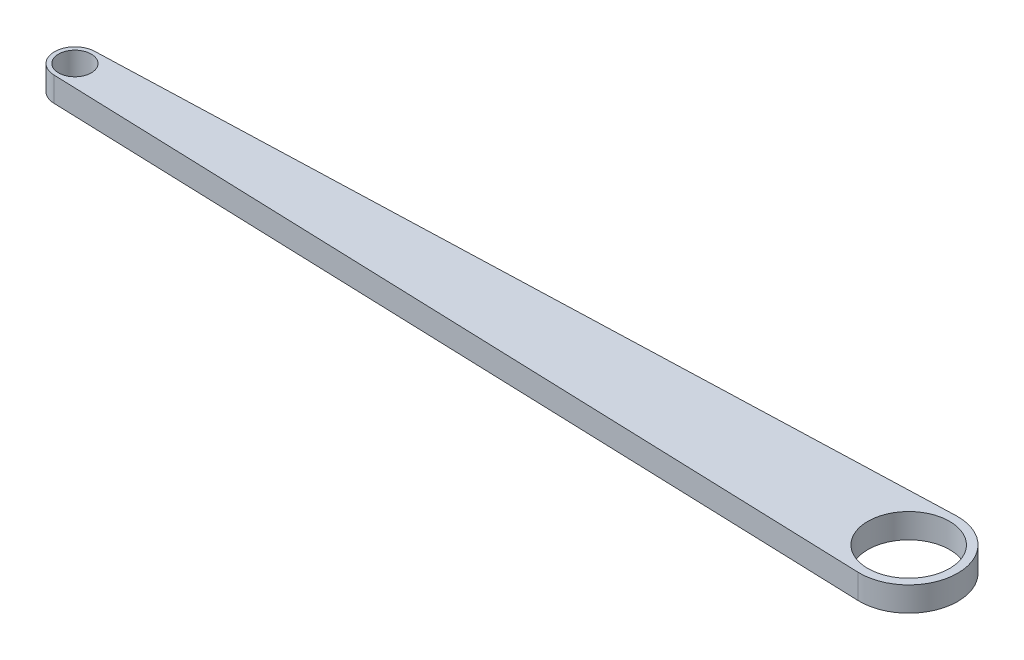
ISO-10303-21;
HEADER;
FILE_DESCRIPTION(('STEP AP214'),'2;1');
FILE_NAME('part.step','',(''),(''),'','','');
FILE_SCHEMA(('AUTOMOTIVE_DESIGN { 1 0 10303 214 1 1 1 1 }'));
ENDSEC;
DATA;
#1=APPLICATION_CONTEXT('core data for automotive mechanical design processes');
#2=APPLICATION_PROTOCOL_DEFINITION('international standard','automotive_design',2000,#1);
#3=PRODUCT_CONTEXT('',#1,'mechanical');
#4=PRODUCT('Part','Part','',(#3));
#5=PRODUCT_RELATED_PRODUCT_CATEGORY('part','',(#4));
#6=PRODUCT_DEFINITION_FORMATION('','',#4);
#7=PRODUCT_DEFINITION_CONTEXT('part definition',#1,'design');
#8=PRODUCT_DEFINITION('design','',#6,#7);
#9=PRODUCT_DEFINITION_SHAPE('','',#8);
#10=(LENGTH_UNIT() NAMED_UNIT(*) SI_UNIT(.MILLI.,.METRE.));
#11=(NAMED_UNIT(*) PLANE_ANGLE_UNIT() SI_UNIT($,.RADIAN.));
#12=(NAMED_UNIT(*) SI_UNIT($,.STERADIAN.) SOLID_ANGLE_UNIT());
#13=UNCERTAINTY_MEASURE_WITH_UNIT(LENGTH_MEASURE(1.E-05),#10,'distance_accuracy_value','');
#14=(GEOMETRIC_REPRESENTATION_CONTEXT(3) GLOBAL_UNCERTAINTY_ASSIGNED_CONTEXT((#13)) GLOBAL_UNIT_ASSIGNED_CONTEXT((#10,
#11,#12)) REPRESENTATION_CONTEXT('',''));
#15=CARTESIAN_POINT('',(0.,0.,0.));
#16=DIRECTION('',(0.,0.,1.));
#17=DIRECTION('',(1.,0.,0.));
#18=AXIS2_PLACEMENT_3D('',#15,#16,#17);
#19=CARTESIAN_POINT('',(-51.,0.75,0.));
#20=DIRECTION('',(0.,-1.,0.));
#21=DIRECTION('',(0.,0.,-1.));
#22=AXIS2_PLACEMENT_3D('',#19,#20,#21);
#23=CYLINDRICAL_SURFACE('',#22,1.25);
#24=CARTESIAN_POINT('',(-51.,-0.75,0.));
#25=DIRECTION('',(0.,1.,0.));
#26=DIRECTION('',(0.,0.,1.));
#27=AXIS2_PLACEMENT_3D('',#24,#25,#26);
#28=CIRCLE('',#27,1.25);
#29=CARTESIAN_POINT('',(-51.0428921568627,-0.75,-1.24926388840775));
#30=VERTEX_POINT('',#29);
#31=CARTESIAN_POINT('',(-51.0428921568627,-0.75,1.24926388840775));
#32=VERTEX_POINT('',#31);
#33=EDGE_CURVE('E95',#30,#32,#28,.T.);
#34=ORIENTED_EDGE('',*,*,#33,.T.);
#35=DIRECTION('',(0.,-1.,0.));
#36=VECTOR('',#35,1.);
#37=CARTESIAN_POINT('',(-51.0428921568627,0.75,1.24926388840775));
#38=LINE('',#37,#36);
#39=CARTESIAN_POINT('',(-51.0428921568627,0.75,1.24926388840775));
#40=VERTEX_POINT('',#39);
#41=EDGE_CURVE('E11',#40,#32,#38,.T.);
#42=ORIENTED_EDGE('',*,*,#41,.F.);
#43=CARTESIAN_POINT('',(-51.,0.75,0.));
#44=DIRECTION('',(0.,1.,0.));
#45=DIRECTION('',(0.,0.,1.));
#46=AXIS2_PLACEMENT_3D('',#43,#44,#45);
#47=CIRCLE('',#46,1.25);
#48=CARTESIAN_POINT('',(-51.0428921568627,0.75,-1.24926388840775));
#49=VERTEX_POINT('',#48);
#50=EDGE_CURVE('E83',#49,#40,#47,.T.);
#51=ORIENTED_EDGE('',*,*,#50,.F.);
#52=DIRECTION('',(0.,-1.,0.));
#53=VECTOR('',#52,1.);
#54=CARTESIAN_POINT('',(-51.0428921568627,0.75,-1.24926388840775));
#55=LINE('',#54,#53);
#56=EDGE_CURVE('E91',#49,#30,#55,.T.);
#57=ORIENTED_EDGE('',*,*,#56,.T.);
#58=EDGE_LOOP('',(#34,#42,#51,#57));
#59=FACE_BOUND('',#58,.T.);
#60=ADVANCED_FACE('F32',(#59),#23,.T.);
#61=CARTESIAN_POINT('',(-51.0428921568627,0.75,1.24926388840775));
#62=DIRECTION('',(0.0343137254901961,0.,-0.999411110726203));
#63=DIRECTION('',(-0.999411110726203,0.,-0.0343137254901961));
#64=AXIS2_PLACEMENT_3D('',#61,#62,#63);
#65=PLANE('',#64);
#66=DIRECTION('',(0.999411110726203,0.,0.0343137254901961));
#67=VECTOR('',#66,1.);
#68=CARTESIAN_POINT('',(-51.0428921568627,-0.75,1.24926388840775));
#69=LINE('',#68,#67);
#70=CARTESIAN_POINT('',(-0.102941176470588,-0.75,2.99823333217861));
#71=VERTEX_POINT('',#70);
#72=EDGE_CURVE('E87',#32,#71,#69,.T.);
#73=ORIENTED_EDGE('',*,*,#72,.T.);
#74=DIRECTION('',(0.,-1.,0.));
#75=VECTOR('',#74,1.);
#76=CARTESIAN_POINT('',(-0.102941176470588,0.75,2.99823333217861));
#77=LINE('',#76,#75);
#78=CARTESIAN_POINT('',(-0.102941176470588,0.75,2.99823333217861));
#79=VERTEX_POINT('',#78);
#80=EDGE_CURVE('E40',#79,#71,#77,.T.);
#81=ORIENTED_EDGE('',*,*,#80,.F.);
#82=DIRECTION('',(0.999411110726203,0.,0.0343137254901961));
#83=VECTOR('',#82,1.);
#84=CARTESIAN_POINT('',(-51.0428921568627,0.75,1.24926388840775));
#85=LINE('',#84,#83);
#86=EDGE_CURVE('E78',#40,#79,#85,.T.);
#87=ORIENTED_EDGE('',*,*,#86,.F.);
#88=ORIENTED_EDGE('',*,*,#41,.T.);
#89=EDGE_LOOP('',(#73,#81,#87,#88));
#90=FACE_BOUND('',#89,.T.);
#91=ADVANCED_FACE('F86',(#90),#65,.F.);
#92=CARTESIAN_POINT('',(0.,0.75,0.));
#93=DIRECTION('',(0.,-1.,0.));
#94=DIRECTION('',(0.,0.,-1.));
#95=AXIS2_PLACEMENT_3D('',#92,#93,#94);
#96=CYLINDRICAL_SURFACE('',#95,3.);
#97=CARTESIAN_POINT('',(0.,-0.75,0.));
#98=DIRECTION('',(0.,1.,0.));
#99=DIRECTION('',(0.,0.,1.));
#100=AXIS2_PLACEMENT_3D('',#97,#98,#99);
#101=CIRCLE('',#100,3.);
#102=CARTESIAN_POINT('',(-0.102941176470588,-0.75,-2.99823333217861));
#103=VERTEX_POINT('',#102);
#104=EDGE_CURVE('E65',#71,#103,#101,.T.);
#105=ORIENTED_EDGE('',*,*,#104,.T.);
#106=DIRECTION('',(0.,-1.,0.));
#107=VECTOR('',#106,1.);
#108=CARTESIAN_POINT('',(-0.102941176470588,0.75,-2.99823333217861));
#109=LINE('',#108,#107);
#110=CARTESIAN_POINT('',(-0.102941176470588,0.75,-2.99823333217861));
#111=VERTEX_POINT('',#110);
#112=EDGE_CURVE('E88',#111,#103,#109,.T.);
#113=ORIENTED_EDGE('',*,*,#112,.F.);
#114=CARTESIAN_POINT('',(0.,0.75,0.));
#115=DIRECTION('',(0.,1.,0.));
#116=DIRECTION('',(0.,0.,1.));
#117=AXIS2_PLACEMENT_3D('',#114,#115,#116);
#118=CIRCLE('',#117,3.);
#119=EDGE_CURVE('E81',#79,#111,#118,.T.);
#120=ORIENTED_EDGE('',*,*,#119,.F.);
#121=ORIENTED_EDGE('',*,*,#80,.T.);
#122=EDGE_LOOP('',(#105,#113,#120,#121));
#123=FACE_BOUND('',#122,.T.);
#124=ADVANCED_FACE('F89',(#123),#96,.T.);
#125=CARTESIAN_POINT('',(-51.0428921568627,0.75,-1.24926388840775));
#126=DIRECTION('',(0.0343137254901961,0.,0.999411110726203));
#127=DIRECTION('',(0.999411110726203,0.,-0.0343137254901961));
#128=AXIS2_PLACEMENT_3D('',#125,#126,#127);
#129=PLANE('',#128);
#130=DIRECTION('',(-0.999411110726203,0.,0.0343137254901961));
#131=VECTOR('',#130,1.);
#132=CARTESIAN_POINT('',(-51.0428921568627,-0.75,-1.24926388840775));
#133=LINE('',#132,#131);
#134=EDGE_CURVE('E71',#103,#30,#133,.T.);
#135=ORIENTED_EDGE('',*,*,#134,.T.);
#136=ORIENTED_EDGE('',*,*,#56,.F.);
#137=DIRECTION('',(-0.999411110726203,0.,0.0343137254901961));
#138=VECTOR('',#137,1.);
#139=CARTESIAN_POINT('',(-51.0428921568627,0.75,-1.24926388840775));
#140=LINE('',#139,#138);
#141=EDGE_CURVE('E48',#111,#49,#140,.T.);
#142=ORIENTED_EDGE('',*,*,#141,.F.);
#143=ORIENTED_EDGE('',*,*,#112,.T.);
#144=EDGE_LOOP('',(#135,#136,#142,#143));
#145=FACE_BOUND('',#144,.T.);
#146=ADVANCED_FACE('F103',(#145),#129,.F.);
#147=CARTESIAN_POINT('',(-51.,0.75,0.));
#148=DIRECTION('',(0.,1.,0.));
#149=DIRECTION('',(0.,0.,1.));
#150=AXIS2_PLACEMENT_3D('',#147,#148,#149);
#151=PLANE('',#150);
#152=CARTESIAN_POINT('',(0.,0.75,0.));
#153=DIRECTION('',(0.,1.,0.));
#154=DIRECTION('',(0.,0.,1.));
#155=AXIS2_PLACEMENT_3D('',#152,#153,#154);
#156=CIRCLE('',#155,2.5);
#157=CARTESIAN_POINT('',(0.,0.75,2.5));
#158=VERTEX_POINT('',#157);
#159=EDGE_CURVE('E112',#158,#158,#156,.T.);
#160=ORIENTED_EDGE('',*,*,#159,.F.);
#161=EDGE_LOOP('',(#160));
#162=FACE_BOUND('',#161,.T.);
#163=CARTESIAN_POINT('',(-51.,0.75,0.));
#164=DIRECTION('',(0.,1.,0.));
#165=DIRECTION('',(0.,0.,1.));
#166=AXIS2_PLACEMENT_3D('',#163,#164,#165);
#167=CIRCLE('',#166,0.999999999999998);
#168=CARTESIAN_POINT('',(-51.,0.75,0.999999999999998));
#169=VERTEX_POINT('',#168);
#170=EDGE_CURVE('E113',#169,#169,#167,.T.);
#171=ORIENTED_EDGE('',*,*,#170,.F.);
#172=EDGE_LOOP('',(#171));
#173=FACE_BOUND('',#172,.T.);
#174=ORIENTED_EDGE('',*,*,#50,.T.);
#175=ORIENTED_EDGE('',*,*,#86,.T.);
#176=ORIENTED_EDGE('',*,*,#119,.T.);
#177=ORIENTED_EDGE('',*,*,#141,.T.);
#178=EDGE_LOOP('',(#174,#175,#176,#177));
#179=FACE_BOUND('',#178,.T.);
#180=ADVANCED_FACE('F79',(#162,#173,#179),#151,.T.);
#181=CARTESIAN_POINT('',(-51.,-0.75,0.));
#182=DIRECTION('',(0.,1.,0.));
#183=DIRECTION('',(0.,0.,1.));
#184=AXIS2_PLACEMENT_3D('',#181,#182,#183);
#185=PLANE('',#184);
#186=CARTESIAN_POINT('',(0.,-0.75,0.));
#187=DIRECTION('',(0.,1.,0.));
#188=DIRECTION('',(0.,0.,1.));
#189=AXIS2_PLACEMENT_3D('',#186,#187,#188);
#190=CIRCLE('',#189,2.5);
#191=CARTESIAN_POINT('',(0.,-0.75,2.5));
#192=VERTEX_POINT('',#191);
#193=EDGE_CURVE('E98',#192,#192,#190,.F.);
#194=ORIENTED_EDGE('',*,*,#193,.F.);
#195=EDGE_LOOP('',(#194));
#196=FACE_BOUND('',#195,.T.);
#197=CARTESIAN_POINT('',(-51.,-0.75,0.));
#198=DIRECTION('',(0.,1.,0.));
#199=DIRECTION('',(0.,0.,1.));
#200=AXIS2_PLACEMENT_3D('',#197,#198,#199);
#201=CIRCLE('',#200,0.999999999999998);
#202=CARTESIAN_POINT('',(-51.,-0.75,0.999999999999998));
#203=VERTEX_POINT('',#202);
#204=EDGE_CURVE('E109',#203,#203,#201,.F.);
#205=ORIENTED_EDGE('',*,*,#204,.F.);
#206=EDGE_LOOP('',(#205));
#207=FACE_BOUND('',#206,.T.);
#208=ORIENTED_EDGE('',*,*,#33,.F.);
#209=ORIENTED_EDGE('',*,*,#134,.F.);
#210=ORIENTED_EDGE('',*,*,#104,.F.);
#211=ORIENTED_EDGE('',*,*,#72,.F.);
#212=EDGE_LOOP('',(#208,#209,#210,#211));
#213=FACE_BOUND('',#212,.T.);
#214=ADVANCED_FACE('F106',(#196,#207,#213),#185,.F.);
#215=CARTESIAN_POINT('',(-51.,-0.751,0.));
#216=DIRECTION('',(0.,1.,0.));
#217=DIRECTION('',(0.,0.,1.));
#218=AXIS2_PLACEMENT_3D('',#215,#216,#217);
#219=CYLINDRICAL_SURFACE('',#218,0.999999999999998);
#220=ORIENTED_EDGE('',*,*,#170,.T.);
#221=EDGE_LOOP('',(#220));
#222=FACE_BOUND('',#221,.T.);
#223=ORIENTED_EDGE('',*,*,#204,.T.);
#224=EDGE_LOOP('',(#223));
#225=FACE_BOUND('',#224,.T.);
#226=ADVANCED_FACE('F129',(#222,#225),#219,.F.);
#227=CARTESIAN_POINT('',(0.,-0.751,0.));
#228=DIRECTION('',(0.,1.,0.));
#229=DIRECTION('',(0.,0.,1.));
#230=AXIS2_PLACEMENT_3D('',#227,#228,#229);
#231=CYLINDRICAL_SURFACE('',#230,2.5);
#232=ORIENTED_EDGE('',*,*,#159,.T.);
#233=EDGE_LOOP('',(#232));
#234=FACE_BOUND('',#233,.T.);
#235=ORIENTED_EDGE('',*,*,#193,.T.);
#236=EDGE_LOOP('',(#235));
#237=FACE_BOUND('',#236,.T.);
#238=ADVANCED_FACE('F121',(#234,#237),#231,.F.);
#239=CLOSED_SHELL('',(#60,#91,#124,#146,#180,#214,#226,#238));
#240=MANIFOLD_SOLID_BREP('B2',#239);
#241=ADVANCED_BREP_SHAPE_REPRESENTATION('',(#18,#240),#14);
#242=SHAPE_DEFINITION_REPRESENTATION(#9,#241);
ENDSEC;
END-ISO-10303-21;
